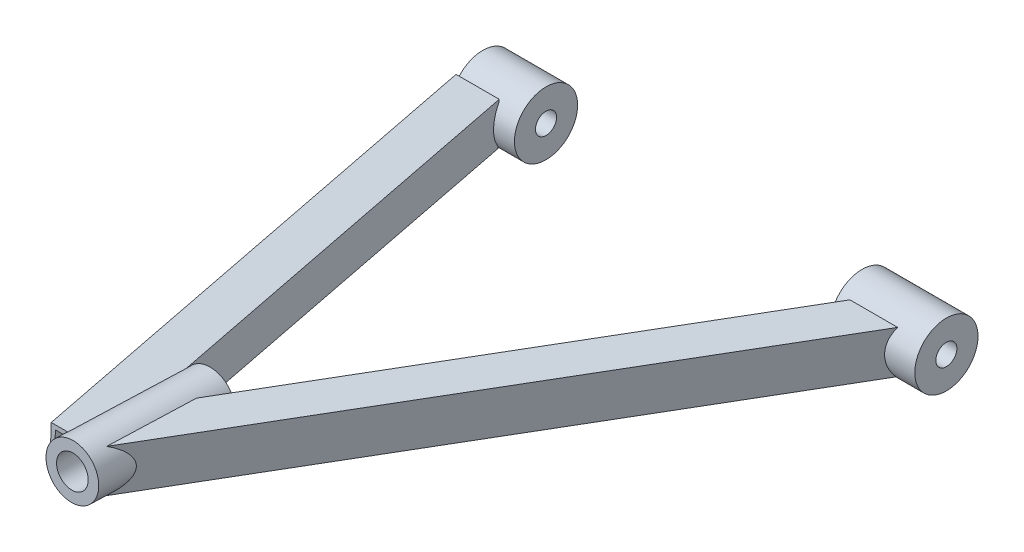
ISO-10303-21;
HEADER;
FILE_DESCRIPTION(('STEP AP214'),'2;1');
FILE_NAME('part.step','',(''),(''),'','','');
FILE_SCHEMA(('AUTOMOTIVE_DESIGN { 1 0 10303 214 1 1 1 1 }'));
ENDSEC;
DATA;
#1=APPLICATION_CONTEXT('core data for automotive mechanical design processes');
#2=APPLICATION_PROTOCOL_DEFINITION('international standard','automotive_design',2000,#1);
#3=PRODUCT_CONTEXT('',#1,'mechanical');
#4=PRODUCT('Part','Part','',(#3));
#5=PRODUCT_RELATED_PRODUCT_CATEGORY('part','',(#4));
#6=PRODUCT_DEFINITION_FORMATION('','',#4);
#7=PRODUCT_DEFINITION_CONTEXT('part definition',#1,'design');
#8=PRODUCT_DEFINITION('design','',#6,#7);
#9=PRODUCT_DEFINITION_SHAPE('','',#8);
#10=(LENGTH_UNIT() NAMED_UNIT(*) SI_UNIT(.MILLI.,.METRE.));
#11=(NAMED_UNIT(*) PLANE_ANGLE_UNIT() SI_UNIT($,.RADIAN.));
#12=(NAMED_UNIT(*) SI_UNIT($,.STERADIAN.) SOLID_ANGLE_UNIT());
#13=UNCERTAINTY_MEASURE_WITH_UNIT(LENGTH_MEASURE(1.E-05),#10,'distance_accuracy_value','');
#14=(GEOMETRIC_REPRESENTATION_CONTEXT(3) GLOBAL_UNCERTAINTY_ASSIGNED_CONTEXT((#13)) GLOBAL_UNIT_ASSIGNED_CONTEXT((#10,
#11,#12)) REPRESENTATION_CONTEXT('',''));
#15=CARTESIAN_POINT('',(0.,0.,0.));
#16=DIRECTION('',(0.,0.,1.));
#17=DIRECTION('',(1.,0.,0.));
#18=AXIS2_PLACEMENT_3D('',#15,#16,#17);
#19=CARTESIAN_POINT('',(0.,1.27434905217525,-0.044501249503039));
#20=DIRECTION('',(0.,0.999390827019096,-0.0348994967025009));
#21=DIRECTION('',(0.,0.0348994967025009,0.999390827019096));
#22=AXIS2_PLACEMENT_3D('',#19,#20,#21);
#23=PLANE('',#22);
#24=DIRECTION('',(0.,-0.0348994967025009,-0.999390827019096));
#25=VECTOR('',#24,1.);
#26=CARTESIAN_POINT('',(77.4721810515776,19.2390864225726,514.398268250256));
#27=LINE('',#26,#25);
#28=CARTESIAN_POINT('',(77.4721810515776,18.9437054344602,505.939663459712));
#29=VERTEX_POINT('',#28);
#30=CARTESIAN_POINT('',(77.4721810515776,17.4552333958201,463.315401156675));
#31=VERTEX_POINT('',#30);
#32=EDGE_CURVE('E59',#29,#31,#27,.T.);
#33=ORIENTED_EDGE('',*,*,#32,.F.);
#34=DIRECTION('',(0.468930497806129,-0.0308244594001443,-0.882697026691483));
#35=VECTOR('',#34,1.);
#36=CARTESIAN_POINT('',(75.6331881514032,19.0645889390601,509.401314115161));
#37=LINE('',#36,#35);
#38=CARTESIAN_POINT('',(207.688955467809,10.3840965052275,260.824534159497));
#39=VERTEX_POINT('',#38);
#40=EDGE_CURVE('E292',#29,#39,#37,.T.);
#41=ORIENTED_EDGE('',*,*,#40,.T.);
#42=DIRECTION('',(-1.,0.,0.));
#43=VECTOR('',#42,1.);
#44=CARTESIAN_POINT('',(220.,10.3840965052275,260.824534159497));
#45=LINE('',#44,#43);
#46=CARTESIAN_POINT('',(185.044927068506,10.3840965052275,260.824534159497));
#47=VERTEX_POINT('',#46);
#48=EDGE_CURVE('E286',#39,#47,#45,.T.);
#49=ORIENTED_EDGE('',*,*,#48,.T.);
#50=DIRECTION('',(-0.468930497806129,0.0308244594001443,0.882697026691483));
#51=VECTOR('',#50,1.);
#52=CARTESIAN_POINT('',(68.527434382737,18.0432032161414,480.152653854107));
#53=LINE('',#52,#51);
#54=EDGE_CURVE('E295',#47,#31,#53,.T.);
#55=ORIENTED_EDGE('',*,*,#54,.T.);
#56=EDGE_LOOP('',(#33,#41,#49,#55));
#57=FACE_BOUND('',#56,.T.);
#58=ADVANCED_FACE('F42',(#57),#23,.T.);
#59=CARTESIAN_POINT('',(0.,-18.7134674882067,0.65348868454698));
#60=DIRECTION('',(0.,0.999390827019096,-0.0348994967025009));
#61=DIRECTION('',(0.,0.0348994967025009,0.999390827019096));
#62=AXIS2_PLACEMENT_3D('',#59,#60,#61);
#63=PLANE('',#62);
#64=DIRECTION('',(0.468930497806129,-0.0308244594001443,-0.882697026691483));
#65=VECTOR('',#64,1.);
#66=CARTESIAN_POINT('',(75.6331881514032,-0.923227601321798,510.099304049211));
#67=LINE('',#66,#65);
#68=CARTESIAN_POINT('',(77.4721810515776,-1.04411110592169,506.637653393762));
#69=VERTEX_POINT('',#68);
#70=CARTESIAN_POINT('',(207.688955467809,-9.60372003515441,261.522524093547));
#71=VERTEX_POINT('',#70);
#72=EDGE_CURVE('E307',#69,#71,#67,.T.);
#73=ORIENTED_EDGE('',*,*,#72,.F.);
#74=DIRECTION('',(0.,-0.0348994967025009,-0.999390827019096));
#75=VECTOR('',#74,1.);
#76=CARTESIAN_POINT('',(77.4721810515776,-0.748730117809291,515.096258184306));
#77=LINE('',#76,#75);
#78=CARTESIAN_POINT('',(77.4721810515776,-2.53258314456182,464.013391090725));
#79=VERTEX_POINT('',#78);
#80=EDGE_CURVE('E387',#69,#79,#77,.T.);
#81=ORIENTED_EDGE('',*,*,#80,.T.);
#82=DIRECTION('',(-0.468930497806129,0.0308244594001443,0.882697026691483));
#83=VECTOR('',#82,1.);
#84=CARTESIAN_POINT('',(68.527434382737,-1.94461332424051,480.850643788157));
#85=LINE('',#84,#83);
#86=CARTESIAN_POINT('',(185.044927068506,-9.60372003515441,261.522524093547));
#87=VERTEX_POINT('',#86);
#88=EDGE_CURVE('E309',#87,#79,#85,.T.);
#89=ORIENTED_EDGE('',*,*,#88,.F.);
#90=DIRECTION('',(-1.,0.,0.));
#91=VECTOR('',#90,1.);
#92=CARTESIAN_POINT('',(220.,-9.60372003515441,261.522524093547));
#93=LINE('',#92,#91);
#94=EDGE_CURVE('E350',#71,#87,#93,.T.);
#95=ORIENTED_EDGE('',*,*,#94,.F.);
#96=EDGE_LOOP('',(#73,#81,#89,#95));
#97=FACE_BOUND('',#96,.T.);
#98=ADVANCED_FACE('F391',(#97),#63,.F.);
#99=CARTESIAN_POINT('',(75.6331881514032,19.0645889390601,509.401314115161));
#100=DIRECTION('',(-0.88323506963169,-0.0163654383618871,-0.468644838016943));
#101=DIRECTION('',(-0.468707608630731,0.,0.883353370747891));
#102=AXIS2_PLACEMENT_3D('',#99,#100,#101);
#103=PLANE('',#102);
#104=ORIENTED_EDGE('',*,*,#40,.F.);
#105=CARTESIAN_POINT('',(69.9721810515775,9.44279867852919,520.406374657945));
#106=DIRECTION('',(-0.88323506963169,-0.0163654383618871,-0.468644838016943));
#107=DIRECTION('',(0.468930497806129,-0.0308244594001443,-0.882697026691484));
#108=AXIS2_PLACEMENT_3D('',#105,#106,#107);
#109=ELLIPSE('',#108,26.6564022994468,12.5);
#110=EDGE_CURVE('E214',#29,#69,#109,.T.);
#111=ORIENTED_EDGE('',*,*,#110,.T.);
#112=ORIENTED_EDGE('',*,*,#72,.T.);
#113=CARTESIAN_POINT('',(213.624863732041,0.,250.));
#114=DIRECTION('',(-0.88323506963169,-0.0163654383618871,-0.468644838016943));
#115=DIRECTION('',(-0.468930497806129,0.0308244594001443,0.882697026691483));
#116=AXIS2_PLACEMENT_3D('',#113,#114,#115);
#117=ELLIPSE('',#116,16.983021299477,15.);
#118=EDGE_CURVE('E283',#39,#71,#117,.F.);
#119=ORIENTED_EDGE('',*,*,#118,.F.);
#120=EDGE_LOOP('',(#104,#111,#112,#119));
#121=FACE_BOUND('',#120,.T.);
#122=ADVANCED_FACE('F404',(#121),#103,.F.);
#123=CARTESIAN_POINT('',(68.527434382737,18.0432032161414,480.152653854107));
#124=DIRECTION('',(0.88323506963169,0.0163654383618871,0.468644838016943));
#125=DIRECTION('',(0.468707608630731,0.,-0.883353370747891));
#126=AXIS2_PLACEMENT_3D('',#123,#124,#125);
#127=PLANE('',#126);
#128=ORIENTED_EDGE('',*,*,#88,.T.);
#129=CARTESIAN_POINT('',(69.9721810515775,7.95432663988906,477.782112354908));
#130=DIRECTION('',(0.88323506963169,0.0163654383618871,0.468644838016943));
#131=DIRECTION('',(0.468930497806129,-0.0308244594001443,-0.882697026691484));
#132=AXIS2_PLACEMENT_3D('',#129,#130,#131);
#133=ELLIPSE('',#132,26.6564022994468,12.5);
#134=EDGE_CURVE('E203',#79,#31,#133,.T.);
#135=ORIENTED_EDGE('',*,*,#134,.T.);
#136=ORIENTED_EDGE('',*,*,#54,.F.);
#137=CARTESIAN_POINT('',(190.980835332739,0.,250.));
#138=DIRECTION('',(0.88323506963169,0.0163654383618871,0.468644838016943));
#139=DIRECTION('',(-0.468930497806129,0.0308244594001443,0.882697026691483));
#140=AXIS2_PLACEMENT_3D('',#137,#138,#139);
#141=ELLIPSE('',#140,16.983021299477,15.);
#142=EDGE_CURVE('E278',#87,#47,#141,.F.);
#143=ORIENTED_EDGE('',*,*,#142,.F.);
#144=EDGE_LOOP('',(#128,#135,#136,#143));
#145=FACE_BOUND('',#144,.T.);
#146=ADVANCED_FACE('F395',(#145),#127,.F.);
#147=CARTESIAN_POINT('',(220.,0.,250.));
#148=DIRECTION('',(1.,0.,0.));
#149=DIRECTION('',(0.,0.,-1.));
#150=AXIS2_PLACEMENT_3D('',#147,#148,#149);
#151=PLANE('',#150);
#152=CARTESIAN_POINT('',(220.,0.,250.));
#153=DIRECTION('',(1.,0.,0.));
#154=DIRECTION('',(0.,0.,-1.));
#155=AXIS2_PLACEMENT_3D('',#152,#153,#154);
#156=CIRCLE('',#155,15.);
#157=CARTESIAN_POINT('',(220.,0.,235.));
#158=VERTEX_POINT('',#157);
#159=EDGE_CURVE('E275',#158,#158,#156,.T.);
#160=ORIENTED_EDGE('',*,*,#159,.T.);
#161=EDGE_LOOP('',(#160));
#162=FACE_BOUND('',#161,.T.);
#163=CARTESIAN_POINT('',(220.,0.,250.));
#164=DIRECTION('',(1.,0.,0.));
#165=DIRECTION('',(0.,0.,-1.));
#166=AXIS2_PLACEMENT_3D('',#163,#164,#165);
#167=CIRCLE('',#166,4.99999999999999);
#168=CARTESIAN_POINT('',(220.,0.,245.));
#169=VERTEX_POINT('',#168);
#170=EDGE_CURVE('E269',#169,#169,#167,.T.);
#171=ORIENTED_EDGE('',*,*,#170,.F.);
#172=EDGE_LOOP('',(#171));
#173=FACE_BOUND('',#172,.T.);
#174=ADVANCED_FACE('F543',(#162,#173),#151,.T.);
#175=CARTESIAN_POINT('',(180.,0.,250.));
#176=DIRECTION('',(1.,0.,0.));
#177=DIRECTION('',(0.,0.,-1.));
#178=AXIS2_PLACEMENT_3D('',#175,#176,#177);
#179=PLANE('',#178);
#180=CARTESIAN_POINT('',(180.,0.,250.));
#181=DIRECTION('',(1.,0.,0.));
#182=DIRECTION('',(0.,0.,-1.));
#183=AXIS2_PLACEMENT_3D('',#180,#181,#182);
#184=CIRCLE('',#183,15.);
#185=CARTESIAN_POINT('',(180.,0.,235.));
#186=VERTEX_POINT('',#185);
#187=EDGE_CURVE('E272',#186,#186,#184,.T.);
#188=ORIENTED_EDGE('',*,*,#187,.F.);
#189=EDGE_LOOP('',(#188));
#190=FACE_BOUND('',#189,.T.);
#191=CARTESIAN_POINT('',(180.,0.,250.));
#192=DIRECTION('',(1.,0.,0.));
#193=DIRECTION('',(0.,0.,-1.));
#194=AXIS2_PLACEMENT_3D('',#191,#192,#193);
#195=CIRCLE('',#194,4.99999999999999);
#196=CARTESIAN_POINT('',(180.,0.,245.));
#197=VERTEX_POINT('',#196);
#198=EDGE_CURVE('E253',#197,#197,#195,.T.);
#199=ORIENTED_EDGE('',*,*,#198,.T.);
#200=EDGE_LOOP('',(#199));
#201=FACE_BOUND('',#200,.T.);
#202=ADVANCED_FACE('F565',(#190,#201),#179,.F.);
#203=CARTESIAN_POINT('',(220.,0.,250.));
#204=DIRECTION('',(-1.,0.,0.));
#205=DIRECTION('',(0.,0.,1.));
#206=AXIS2_PLACEMENT_3D('',#203,#204,#205);
#207=CYLINDRICAL_SURFACE('',#206,15.);
#208=ORIENTED_EDGE('',*,*,#48,.F.);
#209=ORIENTED_EDGE('',*,*,#118,.T.);
#210=ORIENTED_EDGE('',*,*,#94,.T.);
#211=ORIENTED_EDGE('',*,*,#142,.T.);
#212=EDGE_LOOP('',(#208,#209,#210,#211));
#213=FACE_BOUND('',#212,.T.);
#214=ORIENTED_EDGE('',*,*,#159,.F.);
#215=EDGE_LOOP('',(#214));
#216=FACE_BOUND('',#215,.T.);
#217=ORIENTED_EDGE('',*,*,#187,.T.);
#218=EDGE_LOOP('',(#217));
#219=FACE_BOUND('',#218,.T.);
#220=ADVANCED_FACE('F399',(#213,#216,#219),#207,.T.);
#221=CARTESIAN_POINT('',(220.,0.,250.));
#222=DIRECTION('',(-1.,0.,0.));
#223=DIRECTION('',(0.,0.,1.));
#224=AXIS2_PLACEMENT_3D('',#221,#222,#223);
#225=CYLINDRICAL_SURFACE('',#224,4.99999999999999);
#226=ORIENTED_EDGE('',*,*,#170,.T.);
#227=EDGE_LOOP('',(#226));
#228=FACE_BOUND('',#227,.T.);
#229=ORIENTED_EDGE('',*,*,#198,.F.);
#230=EDGE_LOOP('',(#229));
#231=FACE_BOUND('',#230,.T.);
#232=ADVANCED_FACE('F482',(#228,#231),#225,.F.);
#233=CARTESIAN_POINT('',(69.9721810515775,6.9767108667191,449.78685946104));
#234=DIRECTION('',(0.,-0.0348994967025009,-0.999390827019096));
#235=DIRECTION('',(0.,0.999390827019096,-0.0348994967025009));
#236=AXIS2_PLACEMENT_3D('',#233,#234,#235);
#237=PLANE('',#236);
#238=CARTESIAN_POINT('',(69.9721810515775,6.9767108667191,449.78685946104));
#239=DIRECTION('',(0.,-0.0348994967025009,-0.999390827019096));
#240=DIRECTION('',(0.,0.999390827019096,-0.0348994967025009));
#241=AXIS2_PLACEMENT_3D('',#238,#239,#240);
#242=CIRCLE('',#241,12.5);
#243=CARTESIAN_POINT('',(59.579228737345,0.0356885142211256,450.029245302649));
#244=VERTEX_POINT('',#243);
#245=CARTESIAN_POINT('',(59.579228737345,13.9177332192171,449.544473619431));
#246=VERTEX_POINT('',#245);
#247=EDGE_CURVE('E209',#244,#246,#242,.T.);
#248=ORIENTED_EDGE('',*,*,#247,.T.);
#249=DIRECTION('',(0.,-0.999390827019096,0.0348994967025009));
#250=VECTOR('',#249,1.);
#251=CARTESIAN_POINT('',(59.579228737345,16.9706191369101,449.437864494015));
#252=LINE('',#251,#250);
#253=EDGE_CURVE('E11',#246,#244,#252,.T.);
#254=ORIENTED_EDGE('',*,*,#253,.T.);
#255=EDGE_LOOP('',(#248,#254));
#256=FACE_BOUND('',#255,.T.);
#257=ADVANCED_FACE('F468',(#256),#237,.T.);
#258=CARTESIAN_POINT('',(69.9721810515775,9.24517815238166,514.747263217281));
#259=DIRECTION('',(0.,-0.0348994967025009,-0.999390827019096));
#260=DIRECTION('',(0.,0.999390827019096,-0.0348994967025009));
#261=AXIS2_PLACEMENT_3D('',#258,#259,#260);
#262=PLANE('',#261);
#263=CARTESIAN_POINT('',(69.9721810515775,9.24517815238166,514.747263217281));
#264=DIRECTION('',(0.,0.0348994967025009,0.999390827019096));
#265=DIRECTION('',(0.,-0.999390827019096,0.0348994967025009));
#266=AXIS2_PLACEMENT_3D('',#263,#264,#265);
#267=CIRCLE('',#266,7.50000000000001);
#268=CARTESIAN_POINT('',(69.9721810515775,1.74974694973843,515.00900944255));
#269=VERTEX_POINT('',#268);
#270=EDGE_CURVE('E458',#269,#269,#267,.T.);
#271=ORIENTED_EDGE('',*,*,#270,.F.);
#272=EDGE_LOOP('',(#271));
#273=FACE_BOUND('',#272,.T.);
#274=CARTESIAN_POINT('',(69.9721810515775,9.24517815238166,514.747263217281));
#275=DIRECTION('',(0.,-0.0348994967025009,-0.999390827019096));
#276=DIRECTION('',(0.,0.999390827019096,-0.0348994967025009));
#277=AXIS2_PLACEMENT_3D('',#274,#275,#276);
#278=CIRCLE('',#277,12.5);
#279=CARTESIAN_POINT('',(69.9721810515775,21.7375634901204,514.3110195085));
#280=VERTEX_POINT('',#279);
#281=EDGE_CURVE('E448',#280,#280,#278,.T.);
#282=ORIENTED_EDGE('',*,*,#281,.F.);
#283=EDGE_LOOP('',(#282));
#284=FACE_BOUND('',#283,.T.);
#285=ADVANCED_FACE('F476',(#273,#284),#262,.F.);
#286=CARTESIAN_POINT('',(69.9721810515775,9.24517815238166,514.747263217281));
#287=DIRECTION('',(0.,-0.0348994967025009,-0.999390827019096));
#288=DIRECTION('',(0.,0.999390827019096,-0.0348994967025009));
#289=AXIS2_PLACEMENT_3D('',#286,#287,#288);
#290=CYLINDRICAL_SURFACE('',#289,12.5);
#291=CARTESIAN_POINT('',(69.9721810515775,8.27392714118393,486.934273259335));
#292=DIRECTION('',(-0.975722475216309,0.00764336038540298,0.218877203929003));
#293=DIRECTION('',(-0.2190106192808,-0.0340522233063676,-0.975128091447546));
#294=AXIS2_PLACEMENT_3D('',#291,#292,#293);
#295=ELLIPSE('',#294,57.0748580185209,12.5);
#296=CARTESIAN_POINT('',(61.6289919136587,-2.32574408940282,450.11170834627));
#297=VERTEX_POINT('',#296);
#298=CARTESIAN_POINT('',(62.4721810515775,-2.88609661526257,453.890089804816));
#299=VERTEX_POINT('',#298);
#300=EDGE_CURVE('E192',#297,#299,#295,.T.);
#301=ORIENTED_EDGE('',*,*,#300,.F.);
#302=CARTESIAN_POINT('',(61.6289919136587,16.279165822841,449.46201057581));
#303=VERTEX_POINT('',#302);
#304=EDGE_CURVE('E196',#303,#297,#242,.T.);
#305=ORIENTED_EDGE('',*,*,#304,.F.);
#306=CARTESIAN_POINT('',(62.4721810515775,17.1017199251193,453.192099870766));
#307=VERTEX_POINT('',#306);
#308=EDGE_CURVE('E205',#307,#303,#295,.T.);
#309=ORIENTED_EDGE('',*,*,#308,.F.);
#310=DIRECTION('',(0.,-0.0348994967025009,-0.999390827019096));
#311=VECTOR('',#310,1.);
#312=CARTESIAN_POINT('',(62.4721810515775,19.2390864225726,514.398268250256));
#313=LINE('',#312,#311);
#314=CARTESIAN_POINT('',(62.4721810515775,19.0645889390601,509.401314115161));
#315=VERTEX_POINT('',#314);
#316=EDGE_CURVE('E377',#307,#315,#313,.F.);
#317=ORIENTED_EDGE('',*,*,#316,.T.);
#318=CARTESIAN_POINT('',(69.9721810515775,9.07068066886916,509.750309082186));
#319=DIRECTION('',(0.,-0.0348994967025009,-0.999390827019096));
#320=DIRECTION('',(0.,0.999390827019096,-0.0348994967025009));
#321=AXIS2_PLACEMENT_3D('',#318,#319,#320);
#322=CIRCLE('',#321,12.5);
#323=CARTESIAN_POINT('',(60.3674946954283,17.0658072850219,509.471113108566));
#324=VERTEX_POINT('',#323);
#325=EDGE_CURVE('E433',#324,#315,#322,.T.);
#326=ORIENTED_EDGE('',*,*,#325,.F.);
#327=DIRECTION('',(0.,-0.0348994967025009,-0.999390827019096));
#328=VECTOR('',#327,1.);
#329=CARTESIAN_POINT('',(60.3674946954283,17.2403047685344,514.468067243661));
#330=LINE('',#329,#328);
#331=CARTESIAN_POINT('',(60.3674946954283,15.0943987016731,453.017357591674));
#332=VERTEX_POINT('',#331);
#333=EDGE_CURVE('E353',#332,#324,#330,.F.);
#334=ORIENTED_EDGE('',*,*,#333,.F.);
#335=CARTESIAN_POINT('',(69.9721810515775,8.59262855225802,496.060687588475));
#336=DIRECTION('',(-0.975722475216309,0.00764336038540298,0.218877203929003));
#337=DIRECTION('',(-0.2190106192808,-0.0340522233063676,-0.975128091447546));
#338=AXIS2_PLACEMENT_3D('',#335,#336,#337);
#339=ELLIPSE('',#338,57.0748580185209,12.5);
#340=EDGE_CURVE('E446',#332,#246,#339,.T.);
#341=ORIENTED_EDGE('',*,*,#340,.T.);
#342=ORIENTED_EDGE('',*,*,#247,.F.);
#343=CARTESIAN_POINT('',(60.3674946954283,-0.895854530632472,453.575749538914));
#344=VERTEX_POINT('',#343);
#345=EDGE_CURVE('E383',#244,#344,#339,.T.);
#346=ORIENTED_EDGE('',*,*,#345,.T.);
#347=DIRECTION('',(0.,-0.0348994967025009,-0.999390827019096));
#348=VECTOR('',#347,1.);
#349=CARTESIAN_POINT('',(60.3674946954283,1.2500515362289,515.026459190901));
#350=LINE('',#349,#348);
#351=CARTESIAN_POINT('',(60.3674946954283,1.07555405271639,510.029505055806));
#352=VERTEX_POINT('',#351);
#353=EDGE_CURVE('E381',#344,#352,#350,.F.);
#354=ORIENTED_EDGE('',*,*,#353,.T.);
#355=CARTESIAN_POINT('',(62.4721810515775,-0.923227601321798,510.099304049211));
#356=VERTEX_POINT('',#355);
#357=EDGE_CURVE('E385',#356,#352,#322,.T.);
#358=ORIENTED_EDGE('',*,*,#357,.F.);
#359=DIRECTION('',(0.,-0.0348994967025009,-0.999390827019096));
#360=VECTOR('',#359,1.);
#361=CARTESIAN_POINT('',(62.4721810515775,-0.748730117809291,515.096258184306));
#362=LINE('',#361,#360);
#363=EDGE_CURVE('E199',#299,#356,#362,.F.);
#364=ORIENTED_EDGE('',*,*,#363,.F.);
#365=EDGE_LOOP('',(#301,#305,#309,#317,#326,#334,#341,#342,#346,#354,#358,#364));
#366=FACE_BOUND('',#365,.T.);
#367=ORIENTED_EDGE('',*,*,#281,.T.);
#368=EDGE_LOOP('',(#367));
#369=FACE_BOUND('',#368,.T.);
#370=ORIENTED_EDGE('',*,*,#110,.F.);
#371=ORIENTED_EDGE('',*,*,#32,.T.);
#372=ORIENTED_EDGE('',*,*,#134,.F.);
#373=ORIENTED_EDGE('',*,*,#80,.F.);
#374=EDGE_LOOP('',(#370,#371,#372,#373));
#375=FACE_BOUND('',#374,.T.);
#376=ADVANCED_FACE('F194',(#366,#369,#375),#290,.T.);
#377=CARTESIAN_POINT('',(69.9721810515775,6.97671086671911,449.78685946104));
#378=DIRECTION('',(0.,-0.0348994967025009,-0.999390827019096));
#379=DIRECTION('',(0.,0.999390827019096,-0.0348994967025009));
#380=AXIS2_PLACEMENT_3D('',#377,#378,#379);
#381=CIRCLE('',#380,7.50000000000001);
#382=CARTESIAN_POINT('',(69.9721810515775,14.4721420693623,449.525113235771));
#383=VERTEX_POINT('',#382);
#384=EDGE_CURVE('E46',#383,#383,#381,.T.);
#385=ORIENTED_EDGE('',*,*,#384,.F.);
#386=EDGE_LOOP('',(#385));
#387=FACE_BOUND('',#386,.T.);
#388=DIRECTION('',(0.,-0.999390827019096,0.0348994967025009));
#389=VECTOR('',#388,1.);
#390=CARTESIAN_POINT('',(61.6289919136587,16.9706191369101,449.437864494015));
#391=LINE('',#390,#389);
#392=EDGE_CURVE('E208',#303,#297,#391,.T.);
#393=ORIENTED_EDGE('',*,*,#392,.F.);
#394=ORIENTED_EDGE('',*,*,#304,.T.);
#395=EDGE_LOOP('',(#393,#394));
#396=FACE_BOUND('',#395,.T.);
#397=ADVANCED_FACE('F207',(#387,#396),#237,.T.);
#398=CARTESIAN_POINT('',(30.,0.,250.));
#399=DIRECTION('',(-1.,0.,0.));
#400=DIRECTION('',(0.,0.,1.));
#401=AXIS2_PLACEMENT_3D('',#398,#399,#400);
#402=CYLINDRICAL_SURFACE('',#401,4.99999999999999);
#403=CARTESIAN_POINT('',(30.,0.,250.));
#404=DIRECTION('',(1.,0.,0.));
#405=DIRECTION('',(0.,0.,-1.));
#406=AXIS2_PLACEMENT_3D('',#403,#404,#405);
#407=CIRCLE('',#406,4.99999999999999);
#408=CARTESIAN_POINT('',(30.,0.,245.));
#409=VERTEX_POINT('',#408);
#410=EDGE_CURVE('E333',#409,#409,#407,.T.);
#411=ORIENTED_EDGE('',*,*,#410,.T.);
#412=EDGE_LOOP('',(#411));
#413=FACE_BOUND('',#412,.T.);
#414=CARTESIAN_POINT('',(0.,0.,250.));
#415=DIRECTION('',(1.,0.,0.));
#416=DIRECTION('',(0.,0.,-1.));
#417=AXIS2_PLACEMENT_3D('',#414,#415,#416);
#418=CIRCLE('',#417,4.99999999999999);
#419=CARTESIAN_POINT('',(0.,0.,245.));
#420=VERTEX_POINT('',#419);
#421=EDGE_CURVE('E332',#420,#420,#418,.T.);
#422=ORIENTED_EDGE('',*,*,#421,.F.);
#423=EDGE_LOOP('',(#422));
#424=FACE_BOUND('',#423,.T.);
#425=ADVANCED_FACE('F44',(#413,#424),#402,.F.);
#426=CARTESIAN_POINT('',(30.,0.,0.));
#427=DIRECTION('',(1.,0.,0.));
#428=DIRECTION('',(0.,0.,-1.));
#429=AXIS2_PLACEMENT_3D('',#426,#427,#428);
#430=PLANE('',#429);
#431=ORIENTED_EDGE('',*,*,#410,.F.);
#432=EDGE_LOOP('',(#431));
#433=FACE_BOUND('',#432,.T.);
#434=CARTESIAN_POINT('',(30.,0.,250.));
#435=DIRECTION('',(1.,0.,0.));
#436=DIRECTION('',(0.,0.,-1.));
#437=AXIS2_PLACEMENT_3D('',#434,#435,#436);
#438=CIRCLE('',#437,15.);
#439=CARTESIAN_POINT('',(30.,0.,235.));
#440=VERTEX_POINT('',#439);
#441=EDGE_CURVE('E336',#440,#440,#438,.T.);
#442=ORIENTED_EDGE('',*,*,#441,.T.);
#443=EDGE_LOOP('',(#442));
#444=FACE_BOUND('',#443,.T.);
#445=ADVANCED_FACE('F474',(#433,#444),#430,.T.);
#446=CARTESIAN_POINT('',(0.,0.,0.));
#447=DIRECTION('',(1.,0.,0.));
#448=DIRECTION('',(0.,0.,-1.));
#449=AXIS2_PLACEMENT_3D('',#446,#447,#448);
#450=PLANE('',#449);
#451=ORIENTED_EDGE('',*,*,#421,.T.);
#452=EDGE_LOOP('',(#451));
#453=FACE_BOUND('',#452,.T.);
#454=DIRECTION('',(0.,-0.999390827019096,0.0348994967025009));
#455=VECTOR('',#454,1.);
#456=CARTESIAN_POINT('',(0.,9.13835317844566,261.688196206707));
#457=LINE('',#456,#455);
#458=CARTESIAN_POINT('',(0.,9.41331140360184,261.678594453907));
#459=VERTEX_POINT('',#458);
#460=CARTESIAN_POINT('',(0.,-8.57572348274193,262.306785394552));
#461=VERTEX_POINT('',#460);
#462=EDGE_CURVE('E340',#459,#461,#457,.T.);
#463=ORIENTED_EDGE('',*,*,#462,.F.);
#464=CARTESIAN_POINT('',(0.,0.,250.));
#465=DIRECTION('',(1.,0.,0.));
#466=DIRECTION('',(0.,0.,-1.));
#467=AXIS2_PLACEMENT_3D('',#464,#465,#466);
#468=CIRCLE('',#467,15.);
#469=EDGE_CURVE('E337',#461,#459,#468,.T.);
#470=ORIENTED_EDGE('',*,*,#469,.F.);
#471=EDGE_LOOP('',(#463,#470));
#472=FACE_BOUND('',#471,.T.);
#473=ADVANCED_FACE('F509',(#453,#472),#450,.F.);
#474=CARTESIAN_POINT('',(54.5989572292252,19.0645889390601,509.401314115161));
#475=DIRECTION('',(0.975722475216309,-0.00764336038540298,-0.218877203929003));
#476=DIRECTION('',(-0.21888359771712,0.,-0.975750977786038));
#477=AXIS2_PLACEMENT_3D('',#474,#475,#476);
#478=PLANE('',#477);
#479=DIRECTION('',(0.2190106192808,0.0340522233063676,0.975128091447546));
#480=VECTOR('',#479,1.);
#481=CARTESIAN_POINT('',(54.5989572292252,-0.923227601321798,510.099304049211));
#482=LINE('',#481,#480);
#483=CARTESIAN_POINT('',(-1.04660367628754,-9.57511430976101,262.341684891254));
#484=VERTEX_POINT('',#483);
#485=CARTESIAN_POINT('',(54.5989572292252,-0.923227601321798,510.099304049211));
#486=VERTEX_POINT('',#485);
#487=EDGE_CURVE('E293',#484,#486,#482,.T.);
#488=ORIENTED_EDGE('',*,*,#487,.T.);
#489=DIRECTION('',(0.,-0.999390827019096,0.0348994967025009));
#490=VECTOR('',#489,1.);
#491=CARTESIAN_POINT('',(54.5989572292252,19.0645889390601,509.401314115161));
#492=LINE('',#491,#490);
#493=CARTESIAN_POINT('',(54.5989572292252,19.0645889390601,509.401314115161));
#494=VERTEX_POINT('',#493);
#495=EDGE_CURVE('E304',#494,#486,#492,.T.);
#496=ORIENTED_EDGE('',*,*,#495,.F.);
#497=DIRECTION('',(0.2190106192808,0.0340522233063676,0.975128091447546));
#498=VECTOR('',#497,1.);
#499=CARTESIAN_POINT('',(54.5989572292252,19.0645889390601,509.401314115161));
#500=LINE('',#499,#498);
#501=CARTESIAN_POINT('',(-1.04660367628754,10.4127022306209,261.643694957204));
#502=VERTEX_POINT('',#501);
#503=EDGE_CURVE('E302',#502,#494,#500,.T.);
#504=ORIENTED_EDGE('',*,*,#503,.F.);
#505=DIRECTION('',(0.,-0.999390827019096,0.0348994967025009));
#506=VECTOR('',#505,1.);
#507=CARTESIAN_POINT('',(-1.04660367628754,10.4127022306209,261.643694957204));
#508=LINE('',#507,#506);
#509=EDGE_CURVE('E319',#502,#484,#508,.T.);
#510=ORIENTED_EDGE('',*,*,#509,.T.);
#511=EDGE_LOOP('',(#488,#496,#504,#510));
#512=FACE_BOUND('',#511,.T.);
#513=ADVANCED_FACE('F442',(#512),#478,.F.);
#514=CARTESIAN_POINT('',(30.,0.,250.));
#515=DIRECTION('',(-1.,0.,0.));
#516=DIRECTION('',(0.,0.,1.));
#517=AXIS2_PLACEMENT_3D('',#514,#515,#516);
#518=CYLINDRICAL_SURFACE('',#517,15.);
#519=ORIENTED_EDGE('',*,*,#441,.F.);
#520=EDGE_LOOP('',(#519));
#521=FACE_BOUND('',#520,.T.);
#522=DIRECTION('',(-1.,0.,0.));
#523=VECTOR('',#522,1.);
#524=CARTESIAN_POINT('',(30.,9.41331140360187,261.678594453907));
#525=LINE('',#524,#523);
#526=CARTESIAN_POINT('',(19.451028086849,9.41331140360187,261.678594453907));
#527=VERTEX_POINT('',#526);
#528=EDGE_CURVE('E329',#527,#459,#525,.T.);
#529=ORIENTED_EDGE('',*,*,#528,.F.);
#530=CARTESIAN_POINT('',(16.7575086711084,0.,250.));
#531=DIRECTION('',(-0.975722475216309,0.00764336038540298,0.218877203929003));
#532=DIRECTION('',(-0.2190106192808,-0.0340522233063676,-0.975128091447546));
#533=AXIS2_PLACEMENT_3D('',#530,#531,#532);
#534=ELLIPSE('',#533,15.3732238223524,15.);
#535=CARTESIAN_POINT('',(19.451028086849,-8.57572348274196,262.306785394552));
#536=VERTEX_POINT('',#535);
#537=EDGE_CURVE('E347',#536,#527,#534,.T.);
#538=ORIENTED_EDGE('',*,*,#537,.F.);
#539=DIRECTION('',(-1.,0.,0.));
#540=VECTOR('',#539,1.);
#541=CARTESIAN_POINT('',(30.,-8.57572348274196,262.306785394552));
#542=LINE('',#541,#540);
#543=EDGE_CURVE('E326',#461,#536,#542,.F.);
#544=ORIENTED_EDGE('',*,*,#543,.F.);
#545=ORIENTED_EDGE('',*,*,#469,.T.);
#546=EDGE_LOOP('',(#529,#538,#544,#545));
#547=FACE_BOUND('',#546,.T.);
#548=ADVANCED_FACE('F507',(#521,#547),#518,.T.);
#549=CARTESIAN_POINT('',(-1.04660367628754,10.4127022306209,261.643694957204));
#550=DIRECTION('',(0.,0.0348994967025009,0.999390827019096));
#551=DIRECTION('',(0.,-0.999390827019096,0.0348994967025009));
#552=AXIS2_PLACEMENT_3D('',#549,#550,#551);
#553=PLANE('',#552);
#554=DIRECTION('',(0.,-0.999390827019096,0.0348994967025009));
#555=VECTOR('',#554,1.);
#556=CARTESIAN_POINT('',(19.451028086849,10.4127022306209,261.643694957204));
#557=LINE('',#556,#555);
#558=CARTESIAN_POINT('',(19.451028086849,10.4127022306209,261.643694957204));
#559=VERTEX_POINT('',#558);
#560=EDGE_CURVE('E323',#559,#527,#557,.T.);
#561=ORIENTED_EDGE('',*,*,#560,.T.);
#562=ORIENTED_EDGE('',*,*,#528,.T.);
#563=ORIENTED_EDGE('',*,*,#462,.T.);
#564=ORIENTED_EDGE('',*,*,#543,.T.);
#565=CARTESIAN_POINT('',(19.451028086849,-9.57511430976101,262.341684891254));
#566=VERTEX_POINT('',#565);
#567=EDGE_CURVE('E322',#536,#566,#557,.T.);
#568=ORIENTED_EDGE('',*,*,#567,.T.);
#569=DIRECTION('',(-1.,0.,0.));
#570=VECTOR('',#569,1.);
#571=CARTESIAN_POINT('',(-1.04660367628754,-9.57511430976101,262.341684891254));
#572=LINE('',#571,#570);
#573=EDGE_CURVE('E314',#566,#484,#572,.T.);
#574=ORIENTED_EDGE('',*,*,#573,.T.);
#575=ORIENTED_EDGE('',*,*,#509,.F.);
#576=DIRECTION('',(-1.,0.,0.));
#577=VECTOR('',#576,1.);
#578=CARTESIAN_POINT('',(-1.04660367628754,10.4127022306209,261.643694957204));
#579=LINE('',#578,#577);
#580=EDGE_CURVE('E300',#559,#502,#579,.T.);
#581=ORIENTED_EDGE('',*,*,#580,.F.);
#582=EDGE_LOOP('',(#561,#562,#563,#564,#568,#574,#575,#581));
#583=FACE_BOUND('',#582,.T.);
#584=ADVANCED_FACE('F438',(#583),#553,.F.);
#585=CARTESIAN_POINT('',(-1.04660367628754,10.4825012240259,263.642476611242));
#586=DIRECTION('',(0.,0.0348994967025009,0.999390827019096));
#587=DIRECTION('',(0.,-0.999390827019096,0.0348994967025009));
#588=AXIS2_PLACEMENT_3D('',#585,#586,#587);
#589=PLANE('',#588);
#590=DIRECTION('',(0.,-0.999390827019096,0.0348994967025009));
#591=VECTOR('',#590,1.);
#592=CARTESIAN_POINT('',(17.8501848131588,10.4825012240259,263.642476611242));
#593=LINE('',#592,#591);
#594=CARTESIAN_POINT('',(17.8501848131588,8.48371956998772,263.712275604647));
#595=VERTEX_POINT('',#594);
#596=CARTESIAN_POINT('',(17.8501848131588,-7.50653366231782,264.270667551887));
#597=VERTEX_POINT('',#596);
#598=EDGE_CURVE('E240',#595,#597,#593,.T.);
#599=ORIENTED_EDGE('',*,*,#598,.F.);
#600=DIRECTION('',(-1.,0.,0.));
#601=VECTOR('',#600,1.);
#602=CARTESIAN_POINT('',(-1.04660367628754,8.48371956998772,263.712275604647));
#603=LINE('',#602,#601);
#604=CARTESIAN_POINT('',(1.45207940264954,8.48371956998772,263.712275604647));
#605=VERTEX_POINT('',#604);
#606=EDGE_CURVE('E234',#595,#605,#603,.T.);
#607=ORIENTED_EDGE('',*,*,#606,.T.);
#608=DIRECTION('',(0.,-0.999390827019096,0.0348994967025009));
#609=VECTOR('',#608,1.);
#610=CARTESIAN_POINT('',(1.45207940264955,10.4825012240259,263.642476611242));
#611=LINE('',#610,#609);
#612=CARTESIAN_POINT('',(1.45207940264954,-7.50653366231782,264.270667551887));
#613=VERTEX_POINT('',#612);
#614=EDGE_CURVE('E244',#605,#613,#611,.T.);
#615=ORIENTED_EDGE('',*,*,#614,.T.);
#616=DIRECTION('',(-1.,0.,0.));
#617=VECTOR('',#616,1.);
#618=CARTESIAN_POINT('',(-1.04660367628754,-7.50653366231782,264.270667551887));
#619=LINE('',#618,#617);
#620=EDGE_CURVE('E245',#597,#613,#619,.T.);
#621=ORIENTED_EDGE('',*,*,#620,.F.);
#622=EDGE_LOOP('',(#599,#607,#615,#621));
#623=FACE_BOUND('',#622,.T.);
#624=ADVANCED_FACE('F527',(#623),#589,.T.);
#625=CARTESIAN_POINT('',(56.5504021796578,19.0493022182893,508.963559707303));
#626=DIRECTION('',(0.975722475216309,-0.00764336038540298,-0.218877203929003));
#627=DIRECTION('',(-0.21888359771712,0.,-0.975750977786038));
#628=AXIS2_PLACEMENT_3D('',#625,#626,#627);
#629=PLANE('',#628);
#630=DIRECTION('',(0.2190106192808,0.0340522233063676,0.975128091447546));
#631=VECTOR('',#630,1.);
#632=CARTESIAN_POINT('',(56.5504021796578,1.06026733194559,509.591750647948));
#633=LINE('',#632,#631);
#634=CARTESIAN_POINT('',(56.6487204055388,1.07555405271639,510.029505055806));
#635=VERTEX_POINT('',#634);
#636=EDGE_CURVE('E247',#613,#635,#633,.T.);
#637=ORIENTED_EDGE('',*,*,#636,.F.);
#638=ORIENTED_EDGE('',*,*,#614,.F.);
#639=DIRECTION('',(0.2190106192808,0.0340522233063676,0.975128091447546));
#640=VECTOR('',#639,1.);
#641=CARTESIAN_POINT('',(56.5504021796578,17.0505205642511,509.033358700708));
#642=LINE('',#641,#640);
#643=CARTESIAN_POINT('',(56.6487204055388,17.0658072850219,509.471113108566));
#644=VERTEX_POINT('',#643);
#645=EDGE_CURVE('E236',#605,#644,#642,.T.);
#646=ORIENTED_EDGE('',*,*,#645,.T.);
#647=DIRECTION('',(0.,-0.999390827019096,0.0348994967025009));
#648=VECTOR('',#647,1.);
#649=CARTESIAN_POINT('',(56.6487204055388,19.0645889390601,509.401314115161));
#650=LINE('',#649,#648);
#651=EDGE_CURVE('E239',#644,#635,#650,.T.);
#652=ORIENTED_EDGE('',*,*,#651,.T.);
#653=EDGE_LOOP('',(#637,#638,#646,#652));
#654=FACE_BOUND('',#653,.T.);
#655=ADVANCED_FACE('F535',(#654),#629,.T.);
#656=CARTESIAN_POINT('',(0.,-16.7146858341685,0.583689691141978));
#657=DIRECTION('',(0.,0.999390827019096,-0.0348994967025009));
#658=DIRECTION('',(0.,0.0348994967025009,0.999390827019096));
#659=AXIS2_PLACEMENT_3D('',#656,#657,#658);
#660=PLANE('',#659);
#661=ORIENTED_EDGE('',*,*,#353,.F.);
#662=DIRECTION('',(-0.2190106192808,-0.0340522233063676,-0.975128091447546));
#663=VECTOR('',#662,1.);
#664=CARTESIAN_POINT('',(66.5759894323044,0.0694550505684899,481.21859920261));
#665=LINE('',#664,#663);
#666=EDGE_CURVE('E248',#344,#597,#665,.T.);
#667=ORIENTED_EDGE('',*,*,#666,.T.);
#668=ORIENTED_EDGE('',*,*,#620,.T.);
#669=ORIENTED_EDGE('',*,*,#636,.T.);
#670=DIRECTION('',(1.,0.,0.));
#671=VECTOR('',#670,1.);
#672=CARTESIAN_POINT('',(54.5989572292252,1.07555405271639,510.029505055806));
#673=LINE('',#672,#671);
#674=EDGE_CURVE('E229',#635,#352,#673,.T.);
#675=ORIENTED_EDGE('',*,*,#674,.T.);
#676=EDGE_LOOP('',(#661,#667,#668,#669,#675));
#677=FACE_BOUND('',#676,.T.);
#678=ADVANCED_FACE('F502',(#677),#660,.T.);
#679=CARTESIAN_POINT('',(0.,-0.724432601862944,0.0252977439019629));
#680=DIRECTION('',(0.,0.999390827019096,-0.0348994967025009));
#681=DIRECTION('',(0.,0.0348994967025009,0.999390827019096));
#682=AXIS2_PLACEMENT_3D('',#679,#680,#681);
#683=PLANE('',#682);
#684=DIRECTION('',(-0.2190106192808,-0.0340522233063676,-0.975128091447546));
#685=VECTOR('',#684,1.);
#686=CARTESIAN_POINT('',(66.5759894323044,16.059708282874,480.66020725537));
#687=LINE('',#686,#685);
#688=EDGE_CURVE('E232',#332,#595,#687,.T.);
#689=ORIENTED_EDGE('',*,*,#688,.F.);
#690=ORIENTED_EDGE('',*,*,#333,.T.);
#691=DIRECTION('',(1.,0.,0.));
#692=VECTOR('',#691,1.);
#693=CARTESIAN_POINT('',(54.5989572292252,17.0658072850219,509.471113108566));
#694=LINE('',#693,#692);
#695=EDGE_CURVE('E225',#644,#324,#694,.T.);
#696=ORIENTED_EDGE('',*,*,#695,.F.);
#697=ORIENTED_EDGE('',*,*,#645,.F.);
#698=ORIENTED_EDGE('',*,*,#606,.F.);
#699=EDGE_LOOP('',(#689,#690,#696,#697,#698));
#700=FACE_BOUND('',#699,.T.);
#701=ADVANCED_FACE('F698',(#700),#683,.F.);
#702=CARTESIAN_POINT('',(66.5759894323044,18.0584899369122,480.590408261965));
#703=DIRECTION('',(-0.975722475216309,0.00764336038540298,0.218877203929003));
#704=DIRECTION('',(0.21888359771712,0.,0.975750977786038));
#705=AXIS2_PLACEMENT_3D('',#702,#703,#704);
#706=PLANE('',#705);
#707=ORIENTED_EDGE('',*,*,#345,.F.);
#708=ORIENTED_EDGE('',*,*,#253,.F.);
#709=ORIENTED_EDGE('',*,*,#340,.F.);
#710=ORIENTED_EDGE('',*,*,#688,.T.);
#711=ORIENTED_EDGE('',*,*,#598,.T.);
#712=ORIENTED_EDGE('',*,*,#666,.F.);
#713=EDGE_LOOP('',(#707,#708,#709,#710,#711,#712));
#714=FACE_BOUND('',#713,.T.);
#715=ADVANCED_FACE('F496',(#714),#706,.T.);
#716=CARTESIAN_POINT('',(68.527434382737,18.0432032161414,480.152653854107));
#717=DIRECTION('',(-0.975722475216309,0.00764336038540298,0.218877203929003));
#718=DIRECTION('',(0.21888359771712,0.,0.975750977786038));
#719=AXIS2_PLACEMENT_3D('',#716,#717,#718);
#720=PLANE('',#719);
#721=ORIENTED_EDGE('',*,*,#392,.T.);
#722=ORIENTED_EDGE('',*,*,#300,.T.);
#723=DIRECTION('',(-0.2190106192808,-0.0340522233063676,-0.975128091447546));
#724=VECTOR('',#723,1.);
#725=CARTESIAN_POINT('',(68.527434382737,-1.94461332424051,480.850643788157));
#726=LINE('',#725,#724);
#727=EDGE_CURVE('E312',#299,#566,#726,.T.);
#728=ORIENTED_EDGE('',*,*,#727,.T.);
#729=ORIENTED_EDGE('',*,*,#567,.F.);
#730=ORIENTED_EDGE('',*,*,#537,.T.);
#731=ORIENTED_EDGE('',*,*,#560,.F.);
#732=DIRECTION('',(-0.2190106192808,-0.0340522233063676,-0.975128091447546));
#733=VECTOR('',#732,1.);
#734=CARTESIAN_POINT('',(68.527434382737,18.0432032161414,480.152653854107));
#735=LINE('',#734,#733);
#736=EDGE_CURVE('E298',#307,#559,#735,.T.);
#737=ORIENTED_EDGE('',*,*,#736,.F.);
#738=ORIENTED_EDGE('',*,*,#308,.T.);
#739=EDGE_LOOP('',(#721,#722,#728,#729,#730,#731,#737,#738));
#740=FACE_BOUND('',#739,.T.);
#741=ADVANCED_FACE('F211',(#740),#720,.F.);
#742=ORIENTED_EDGE('',*,*,#727,.F.);
#743=ORIENTED_EDGE('',*,*,#363,.T.);
#744=DIRECTION('',(1.,0.,0.));
#745=VECTOR('',#744,1.);
#746=CARTESIAN_POINT('',(54.5989572292252,-0.923227601321798,510.099304049211));
#747=LINE('',#746,#745);
#748=EDGE_CURVE('E288',#486,#356,#747,.T.);
#749=ORIENTED_EDGE('',*,*,#748,.F.);
#750=ORIENTED_EDGE('',*,*,#487,.F.);
#751=ORIENTED_EDGE('',*,*,#573,.F.);
#752=EDGE_LOOP('',(#742,#743,#749,#750,#751));
#753=FACE_BOUND('',#752,.T.);
#754=ADVANCED_FACE('F415',(#753),#63,.F.);
#755=ORIENTED_EDGE('',*,*,#316,.F.);
#756=ORIENTED_EDGE('',*,*,#736,.T.);
#757=ORIENTED_EDGE('',*,*,#580,.T.);
#758=ORIENTED_EDGE('',*,*,#503,.T.);
#759=DIRECTION('',(1.,0.,0.));
#760=VECTOR('',#759,1.);
#761=CARTESIAN_POINT('',(54.5989572292252,19.0645889390601,509.401314115161));
#762=LINE('',#761,#760);
#763=EDGE_CURVE('E289',#494,#315,#762,.T.);
#764=ORIENTED_EDGE('',*,*,#763,.T.);
#765=EDGE_LOOP('',(#755,#756,#757,#758,#764));
#766=FACE_BOUND('',#765,.T.);
#767=ADVANCED_FACE('F408',(#766),#23,.T.);
#768=CARTESIAN_POINT('',(54.5989572292252,19.0645889390601,509.401314115161));
#769=DIRECTION('',(0.,-0.0348994967025009,-0.999390827019096));
#770=DIRECTION('',(0.,0.999390827019096,-0.0348994967025009));
#771=AXIS2_PLACEMENT_3D('',#768,#769,#770);
#772=PLANE('',#771);
#773=ORIENTED_EDGE('',*,*,#748,.T.);
#774=ORIENTED_EDGE('',*,*,#357,.T.);
#775=ORIENTED_EDGE('',*,*,#674,.F.);
#776=ORIENTED_EDGE('',*,*,#651,.F.);
#777=ORIENTED_EDGE('',*,*,#695,.T.);
#778=ORIENTED_EDGE('',*,*,#325,.T.);
#779=ORIENTED_EDGE('',*,*,#763,.F.);
#780=ORIENTED_EDGE('',*,*,#495,.T.);
#781=EDGE_LOOP('',(#773,#774,#775,#776,#777,#778,#779,#780));
#782=FACE_BOUND('',#781,.T.);
#783=ADVANCED_FACE('F418',(#782),#772,.F.);
#784=CARTESIAN_POINT('',(69.9721810515775,-3.42526541295634,151.913232073373));
#785=DIRECTION('',(0.,0.0348994967025009,0.999390827019096));
#786=DIRECTION('',(0.,-0.999390827019096,0.0348994967025009));
#787=AXIS2_PLACEMENT_3D('',#784,#785,#786);
#788=CYLINDRICAL_SURFACE('',#787,7.50000000000001);
#789=ORIENTED_EDGE('',*,*,#384,.T.);
#790=EDGE_LOOP('',(#789));
#791=FACE_BOUND('',#790,.T.);
#792=ORIENTED_EDGE('',*,*,#270,.T.);
#793=EDGE_LOOP('',(#792));
#794=FACE_BOUND('',#793,.T.);
#795=ADVANCED_FACE('F424',(#791,#794),#788,.F.);
#796=CLOSED_SHELL('',(#58,#98,#122,#146,#174,#202,#220,#232,#257,#285,#376,#397,#425,#445,#473,
#513,#548,#584,#624,#655,#678,#701,#715,#741,#754,#767,#783,#795));
#797=CARTESIAN_POINT('',(220.,0.,250.));
#798=DIRECTION('',(-1.,0.,0.));
#799=DIRECTION('',(0.,0.,1.));
#800=AXIS2_PLACEMENT_3D('',#797,#798,#799);
#801=CYLINDRICAL_SURFACE('',#800,9.99999999999999);
#802=DIRECTION('',(-1.,0.,0.));
#803=VECTOR('',#802,1.);
#804=CARTESIAN_POINT('',(208.174918239225,-7.78572963593782,256.275540935735));
#805=LINE('',#804,#803);
#806=CARTESIAN_POINT('',(208.174918239225,-7.78572963593782,256.275540935735));
#807=VERTEX_POINT('',#806);
#808=CARTESIAN_POINT('',(190.059695519783,-7.78572963593782,256.275540935735));
#809=VERTEX_POINT('',#808);
#810=EDGE_CURVE('E243',#807,#809,#805,.T.);
#811=ORIENTED_EDGE('',*,*,#810,.F.);
#812=CARTESIAN_POINT('',(211.360460892111,0.,250.));
#813=DIRECTION('',(-0.88323506963169,-0.0163654383618871,-0.468644838016943));
#814=DIRECTION('',(-0.468930497806129,0.0308244594001443,0.882697026691483));
#815=AXIS2_PLACEMENT_3D('',#812,#813,#814);
#816=ELLIPSE('',#815,11.3220141996513,10.);
#817=CARTESIAN_POINT('',(208.174918239225,8.20452359636771,255.717148988495));
#818=VERTEX_POINT('',#817);
#819=EDGE_CURVE('E216',#818,#807,#816,.F.);
#820=ORIENTED_EDGE('',*,*,#819,.F.);
#821=DIRECTION('',(-1.,0.,0.));
#822=VECTOR('',#821,1.);
#823=CARTESIAN_POINT('',(208.174918239225,8.20452359636771,255.717148988495));
#824=LINE('',#823,#822);
#825=CARTESIAN_POINT('',(190.059695519783,8.20452359636771,255.717148988495));
#826=VERTEX_POINT('',#825);
#827=EDGE_CURVE('E226',#818,#826,#824,.T.);
#828=ORIENTED_EDGE('',*,*,#827,.T.);
#829=CARTESIAN_POINT('',(193.245238172669,0.,250.));
#830=DIRECTION('',(0.88323506963169,0.0163654383618871,0.468644838016943));
#831=DIRECTION('',(-0.468930497806129,0.0308244594001443,0.882697026691483));
#832=AXIS2_PLACEMENT_3D('',#829,#830,#831);
#833=ELLIPSE('',#832,11.3220141996513,10.);
#834=EDGE_CURVE('E213',#809,#826,#833,.F.);
#835=ORIENTED_EDGE('',*,*,#834,.F.);
#836=EDGE_LOOP('',(#811,#820,#828,#835));
#837=FACE_BOUND('',#836,.T.);
#838=ADVANCED_FACE('F368',(#837),#801,.T.);
#839=DIRECTION('',(0.,-0.0348994967025009,-0.999390827019096));
#840=VECTOR('',#839,1.);
#841=CARTESIAN_POINT('',(79.5768674077268,1.2500515362289,515.026459190901));
#842=LINE('',#841,#840);
#843=CARTESIAN_POINT('',(79.5768674077268,0.667474869502638,498.343646205812));
#844=VERTEX_POINT('',#843);
#845=CARTESIAN_POINT('',(79.5768674077268,-0.523302761409452,464.244236363382));
#846=VERTEX_POINT('',#845);
#847=EDGE_CURVE('E375',#844,#846,#842,.T.);
#848=ORIENTED_EDGE('',*,*,#847,.F.);
#849=DIRECTION('',(0.468930497806129,-0.0308244594001443,-0.882697026691483));
#850=VECTOR('',#849,1.);
#851=CARTESIAN_POINT('',(73.8667180121398,1.04282317599261,509.092215379772));
#852=LINE('',#851,#850);
#853=EDGE_CURVE('E254',#844,#807,#852,.T.);
#854=ORIENTED_EDGE('',*,*,#853,.T.);
#855=ORIENTED_EDGE('',*,*,#810,.T.);
#856=DIRECTION('',(-0.468930497806129,0.0308244594001443,0.882697026691483));
#857=VECTOR('',#856,1.);
#858=CARTESIAN_POINT('',(70.2939045220003,0.086899206521461,481.718134470786));
#859=LINE('',#858,#857);
#860=EDGE_CURVE('E256',#809,#846,#859,.T.);
#861=ORIENTED_EDGE('',*,*,#860,.T.);
#862=EDGE_LOOP('',(#848,#854,#855,#861));
#863=FACE_BOUND('',#862,.T.);
#864=ADVANCED_FACE('F672',(#863),#660,.T.);
#865=DIRECTION('',(0.468930497806129,-0.0308244594001443,-0.882697026691483));
#866=VECTOR('',#865,1.);
#867=CARTESIAN_POINT('',(73.8667180121398,17.0330764082982,508.533823432532));
#868=LINE('',#867,#866);
#869=CARTESIAN_POINT('',(79.5768674077268,16.6577281018082,497.785254258571));
#870=VERTEX_POINT('',#869);
#871=EDGE_CURVE('E222',#870,#818,#868,.T.);
#872=ORIENTED_EDGE('',*,*,#871,.F.);
#873=DIRECTION('',(0.,-0.0348994967025009,-0.999390827019096));
#874=VECTOR('',#873,1.);
#875=CARTESIAN_POINT('',(79.5768674077268,17.2403047685344,514.468067243661));
#876=LINE('',#875,#874);
#877=CARTESIAN_POINT('',(79.5768674077268,15.4669504708961,463.685844416142));
#878=VERTEX_POINT('',#877);
#879=EDGE_CURVE('E52',#870,#878,#876,.T.);
#880=ORIENTED_EDGE('',*,*,#879,.T.);
#881=DIRECTION('',(-0.468930497806129,0.0308244594001443,0.882697026691483));
#882=VECTOR('',#881,1.);
#883=CARTESIAN_POINT('',(70.2939045220003,16.077152438827,481.159742523546));
#884=LINE('',#883,#882);
#885=EDGE_CURVE('E224',#826,#878,#884,.T.);
#886=ORIENTED_EDGE('',*,*,#885,.F.);
#887=ORIENTED_EDGE('',*,*,#827,.F.);
#888=EDGE_LOOP('',(#872,#880,#886,#887));
#889=FACE_BOUND('',#888,.T.);
#890=ADVANCED_FACE('F359',(#889),#683,.F.);
#891=CARTESIAN_POINT('',(73.8667180121398,19.0318580623363,508.464024439127));
#892=DIRECTION('',(-0.88323506963169,-0.0163654383618871,-0.468644838016943));
#893=DIRECTION('',(-0.468707608630731,0.,0.883353370747891));
#894=AXIS2_PLACEMENT_3D('',#891,#892,#893);
#895=PLANE('',#894);
#896=CARTESIAN_POINT('',(69.9721810515775,9.29395147466518,516.143948427641));
#897=DIRECTION('',(-0.88323506963169,-0.0163654383618871,-0.468644838016943));
#898=DIRECTION('',(0.468930497806129,-0.0308244594001443,-0.882697026691484));
#899=AXIS2_PLACEMENT_3D('',#896,#897,#898);
#900=ELLIPSE('',#899,26.6564022994468,12.5);
#901=EDGE_CURVE('E372',#870,#844,#900,.T.);
#902=ORIENTED_EDGE('',*,*,#901,.F.);
#903=ORIENTED_EDGE('',*,*,#871,.T.);
#904=ORIENTED_EDGE('',*,*,#819,.T.);
#905=ORIENTED_EDGE('',*,*,#853,.F.);
#906=EDGE_LOOP('',(#902,#903,#904,#905));
#907=FACE_BOUND('',#906,.T.);
#908=ADVANCED_FACE('F371',(#907),#895,.T.);
#909=CARTESIAN_POINT('',(70.2939045220003,18.0759340928652,481.089943530141));
#910=DIRECTION('',(0.88323506963169,0.0163654383618871,0.468644838016943));
#911=DIRECTION('',(0.468707608630731,0.,-0.883353370747891));
#912=AXIS2_PLACEMENT_3D('',#909,#910,#911);
#913=PLANE('',#912);
#914=CARTESIAN_POINT('',(69.9721810515775,8.10317384375308,482.044538585212));
#915=DIRECTION('',(0.88323506963169,0.0163654383618871,0.468644838016943));
#916=DIRECTION('',(0.468930497806129,-0.0308244594001443,-0.882697026691484));
#917=AXIS2_PLACEMENT_3D('',#914,#915,#916);
#918=ELLIPSE('',#917,26.6564022994468,12.5);
#919=EDGE_CURVE('E67',#846,#878,#918,.T.);
#920=ORIENTED_EDGE('',*,*,#919,.F.);
#921=ORIENTED_EDGE('',*,*,#860,.F.);
#922=ORIENTED_EDGE('',*,*,#834,.T.);
#923=ORIENTED_EDGE('',*,*,#885,.T.);
#924=EDGE_LOOP('',(#920,#921,#922,#923));
#925=FACE_BOUND('',#924,.T.);
#926=ADVANCED_FACE('F363',(#925),#913,.T.);
#927=ORIENTED_EDGE('',*,*,#901,.T.);
#928=ORIENTED_EDGE('',*,*,#847,.T.);
#929=ORIENTED_EDGE('',*,*,#919,.T.);
#930=ORIENTED_EDGE('',*,*,#879,.F.);
#931=EDGE_LOOP('',(#927,#928,#929,#930));
#932=FACE_BOUND('',#931,.T.);
#933=ADVANCED_FACE('F478',(#932),#290,.T.);
#934=CLOSED_SHELL('',(#838,#864,#890,#908,#926,#933));
#935=ORIENTED_CLOSED_SHELL('',*,#934,.T.);
#936=BREP_WITH_VOIDS('B2',#796,(#935));
#937=ADVANCED_BREP_SHAPE_REPRESENTATION('',(#18,#936),#14);
#938=SHAPE_DEFINITION_REPRESENTATION(#9,#937);
ENDSEC;
END-ISO-10303-21;
